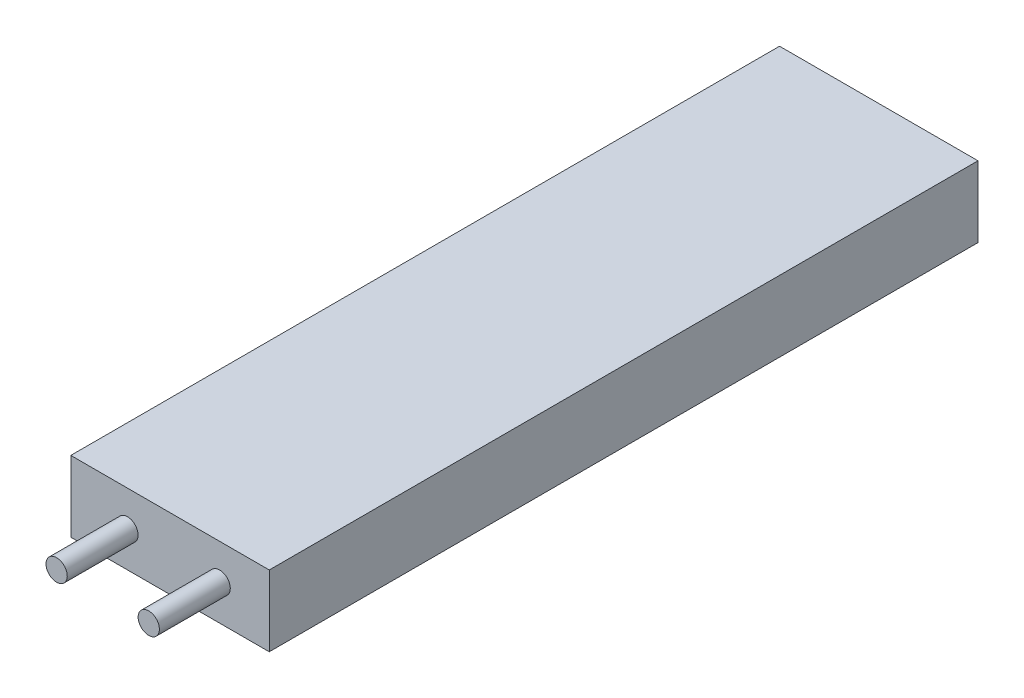
ISO-10303-21;
HEADER;
FILE_DESCRIPTION(('STEP AP214'),'2;1');
FILE_NAME('part.step','',(''),(''),'','','');
FILE_SCHEMA(('AUTOMOTIVE_DESIGN { 1 0 10303 214 1 1 1 1 }'));
ENDSEC;
DATA;
#1=APPLICATION_CONTEXT('core data for automotive mechanical design processes');
#2=APPLICATION_PROTOCOL_DEFINITION('international standard','automotive_design',2000,#1);
#3=PRODUCT_CONTEXT('',#1,'mechanical');
#4=PRODUCT('Part','Part','',(#3));
#5=PRODUCT_RELATED_PRODUCT_CATEGORY('part','',(#4));
#6=PRODUCT_DEFINITION_FORMATION('','',#4);
#7=PRODUCT_DEFINITION_CONTEXT('part definition',#1,'design');
#8=PRODUCT_DEFINITION('design','',#6,#7);
#9=PRODUCT_DEFINITION_SHAPE('','',#8);
#10=(LENGTH_UNIT() NAMED_UNIT(*) SI_UNIT(.MILLI.,.METRE.));
#11=(NAMED_UNIT(*) PLANE_ANGLE_UNIT() SI_UNIT($,.RADIAN.));
#12=(NAMED_UNIT(*) SI_UNIT($,.STERADIAN.) SOLID_ANGLE_UNIT());
#13=UNCERTAINTY_MEASURE_WITH_UNIT(LENGTH_MEASURE(1.E-05),#10,'distance_accuracy_value','');
#14=(GEOMETRIC_REPRESENTATION_CONTEXT(3) GLOBAL_UNCERTAINTY_ASSIGNED_CONTEXT((#13)) GLOBAL_UNIT_ASSIGNED_CONTEXT((#10,
#11,#12)) REPRESENTATION_CONTEXT('',''));
#15=CARTESIAN_POINT('',(0.,0.,0.));
#16=DIRECTION('',(0.,0.,1.));
#17=DIRECTION('',(1.,0.,0.));
#18=AXIS2_PLACEMENT_3D('',#15,#16,#17);
#19=CARTESIAN_POINT('',(-7.,5.,25.));
#20=DIRECTION('',(0.,0.,-1.));
#21=DIRECTION('',(-1.,0.,0.));
#22=AXIS2_PLACEMENT_3D('',#19,#20,#21);
#23=PLANE('',#22);
#24=CARTESIAN_POINT('',(3.5,2.5,25.));
#25=DIRECTION('',(0.,0.,-1.));
#26=DIRECTION('',(-1.,0.,0.));
#27=AXIS2_PLACEMENT_3D('',#24,#25,#26);
#28=CIRCLE('',#27,0.749999999999999);
#29=CARTESIAN_POINT('',(2.75,2.5,25.));
#30=VERTEX_POINT('',#29);
#31=EDGE_CURVE('E11',#30,#30,#28,.F.);
#32=ORIENTED_EDGE('',*,*,#31,.F.);
#33=EDGE_LOOP('',(#32));
#34=FACE_BOUND('',#33,.T.);
#35=CARTESIAN_POINT('',(-3.,2.5,25.));
#36=DIRECTION('',(0.,0.,-1.));
#37=DIRECTION('',(-1.,0.,0.));
#38=AXIS2_PLACEMENT_3D('',#35,#36,#37);
#39=CIRCLE('',#38,0.75);
#40=CARTESIAN_POINT('',(-3.75,2.5,25.));
#41=VERTEX_POINT('',#40);
#42=EDGE_CURVE('E48',#41,#41,#39,.F.);
#43=ORIENTED_EDGE('',*,*,#42,.F.);
#44=EDGE_LOOP('',(#43));
#45=FACE_BOUND('',#44,.T.);
#46=DIRECTION('',(1.,0.,0.));
#47=VECTOR('',#46,1.);
#48=CARTESIAN_POINT('',(-7.,0.,25.));
#49=LINE('',#48,#47);
#50=CARTESIAN_POINT('',(-7.,0.,25.));
#51=VERTEX_POINT('',#50);
#52=CARTESIAN_POINT('',(7.,0.,25.));
#53=VERTEX_POINT('',#52);
#54=EDGE_CURVE('E111',#51,#53,#49,.T.);
#55=ORIENTED_EDGE('',*,*,#54,.T.);
#56=DIRECTION('',(0.,-1.,0.));
#57=VECTOR('',#56,1.);
#58=CARTESIAN_POINT('',(7.,5.,25.));
#59=LINE('',#58,#57);
#60=CARTESIAN_POINT('',(7.,5.,25.));
#61=VERTEX_POINT('',#60);
#62=EDGE_CURVE('E101',#61,#53,#59,.T.);
#63=ORIENTED_EDGE('',*,*,#62,.F.);
#64=DIRECTION('',(1.,0.,0.));
#65=VECTOR('',#64,1.);
#66=CARTESIAN_POINT('',(-7.,5.,25.));
#67=LINE('',#66,#65);
#68=CARTESIAN_POINT('',(-7.,5.,25.));
#69=VERTEX_POINT('',#68);
#70=EDGE_CURVE('E90',#69,#61,#67,.T.);
#71=ORIENTED_EDGE('',*,*,#70,.F.);
#72=DIRECTION('',(0.,-1.,0.));
#73=VECTOR('',#72,1.);
#74=CARTESIAN_POINT('',(-7.,5.,25.));
#75=LINE('',#74,#73);
#76=EDGE_CURVE('E56',#69,#51,#75,.T.);
#77=ORIENTED_EDGE('',*,*,#76,.T.);
#78=EDGE_LOOP('',(#55,#63,#71,#77));
#79=FACE_BOUND('',#78,.T.);
#80=ADVANCED_FACE('F39',(#34,#45,#79),#23,.F.);
#81=CARTESIAN_POINT('',(7.,5.,25.));
#82=DIRECTION('',(-1.,0.,0.));
#83=DIRECTION('',(0.,0.,1.));
#84=AXIS2_PLACEMENT_3D('',#81,#82,#83);
#85=PLANE('',#84);
#86=DIRECTION('',(0.,0.,-1.));
#87=VECTOR('',#86,1.);
#88=CARTESIAN_POINT('',(7.,0.,25.));
#89=LINE('',#88,#87);
#90=CARTESIAN_POINT('',(7.,0.,-25.));
#91=VERTEX_POINT('',#90);
#92=EDGE_CURVE('E97',#53,#91,#89,.T.);
#93=ORIENTED_EDGE('',*,*,#92,.T.);
#94=DIRECTION('',(0.,-1.,0.));
#95=VECTOR('',#94,1.);
#96=CARTESIAN_POINT('',(7.,5.,-25.));
#97=LINE('',#96,#95);
#98=CARTESIAN_POINT('',(7.,5.,-25.));
#99=VERTEX_POINT('',#98);
#100=EDGE_CURVE('E95',#99,#91,#97,.T.);
#101=ORIENTED_EDGE('',*,*,#100,.F.);
#102=DIRECTION('',(0.,0.,-1.));
#103=VECTOR('',#102,1.);
#104=CARTESIAN_POINT('',(7.,5.,25.));
#105=LINE('',#104,#103);
#106=EDGE_CURVE('E82',#61,#99,#105,.T.);
#107=ORIENTED_EDGE('',*,*,#106,.F.);
#108=ORIENTED_EDGE('',*,*,#62,.T.);
#109=EDGE_LOOP('',(#93,#101,#107,#108));
#110=FACE_BOUND('',#109,.T.);
#111=ADVANCED_FACE('F96',(#110),#85,.F.);
#112=CARTESIAN_POINT('',(-7.,5.,-25.));
#113=DIRECTION('',(0.,0.,-1.));
#114=DIRECTION('',(-1.,0.,0.));
#115=AXIS2_PLACEMENT_3D('',#112,#113,#114);
#116=PLANE('',#115);
#117=DIRECTION('',(1.,0.,0.));
#118=VECTOR('',#117,1.);
#119=CARTESIAN_POINT('',(-7.,0.,-25.));
#120=LINE('',#119,#118);
#121=CARTESIAN_POINT('',(-7.,0.,-25.));
#122=VERTEX_POINT('',#121);
#123=EDGE_CURVE('E117',#122,#91,#120,.T.);
#124=ORIENTED_EDGE('',*,*,#123,.F.);
#125=DIRECTION('',(0.,-1.,0.));
#126=VECTOR('',#125,1.);
#127=CARTESIAN_POINT('',(-7.,5.,-25.));
#128=LINE('',#127,#126);
#129=CARTESIAN_POINT('',(-7.,5.,-25.));
#130=VERTEX_POINT('',#129);
#131=EDGE_CURVE('E70',#130,#122,#128,.T.);
#132=ORIENTED_EDGE('',*,*,#131,.F.);
#133=DIRECTION('',(1.,0.,0.));
#134=VECTOR('',#133,1.);
#135=CARTESIAN_POINT('',(-7.,5.,-25.));
#136=LINE('',#135,#134);
#137=EDGE_CURVE('E89',#130,#99,#136,.T.);
#138=ORIENTED_EDGE('',*,*,#137,.T.);
#139=ORIENTED_EDGE('',*,*,#100,.T.);
#140=EDGE_LOOP('',(#124,#132,#138,#139));
#141=FACE_BOUND('',#140,.T.);
#142=ADVANCED_FACE('F103',(#141),#116,.T.);
#143=CARTESIAN_POINT('',(-7.,5.,25.));
#144=DIRECTION('',(-1.,0.,0.));
#145=DIRECTION('',(0.,0.,1.));
#146=AXIS2_PLACEMENT_3D('',#143,#144,#145);
#147=PLANE('',#146);
#148=DIRECTION('',(0.,0.,-1.));
#149=VECTOR('',#148,1.);
#150=CARTESIAN_POINT('',(-7.,0.,25.));
#151=LINE('',#150,#149);
#152=EDGE_CURVE('E120',#51,#122,#151,.T.);
#153=ORIENTED_EDGE('',*,*,#152,.F.);
#154=ORIENTED_EDGE('',*,*,#76,.F.);
#155=DIRECTION('',(0.,0.,-1.));
#156=VECTOR('',#155,1.);
#157=CARTESIAN_POINT('',(-7.,5.,25.));
#158=LINE('',#157,#156);
#159=EDGE_CURVE('E105',#69,#130,#158,.T.);
#160=ORIENTED_EDGE('',*,*,#159,.T.);
#161=ORIENTED_EDGE('',*,*,#131,.T.);
#162=EDGE_LOOP('',(#153,#154,#160,#161));
#163=FACE_BOUND('',#162,.T.);
#164=ADVANCED_FACE('F139',(#163),#147,.T.);
#165=CARTESIAN_POINT('',(0.,5.,0.));
#166=DIRECTION('',(0.,1.,0.));
#167=DIRECTION('',(0.,0.,1.));
#168=AXIS2_PLACEMENT_3D('',#165,#166,#167);
#169=PLANE('',#168);
#170=ORIENTED_EDGE('',*,*,#70,.T.);
#171=ORIENTED_EDGE('',*,*,#106,.T.);
#172=ORIENTED_EDGE('',*,*,#137,.F.);
#173=ORIENTED_EDGE('',*,*,#159,.F.);
#174=EDGE_LOOP('',(#170,#171,#172,#173));
#175=FACE_BOUND('',#174,.T.);
#176=ADVANCED_FACE('F86',(#175),#169,.T.);
#177=CARTESIAN_POINT('',(0.,0.,0.));
#178=DIRECTION('',(0.,1.,0.));
#179=DIRECTION('',(0.,0.,1.));
#180=AXIS2_PLACEMENT_3D('',#177,#178,#179);
#181=PLANE('',#180);
#182=ORIENTED_EDGE('',*,*,#54,.F.);
#183=ORIENTED_EDGE('',*,*,#152,.T.);
#184=ORIENTED_EDGE('',*,*,#123,.T.);
#185=ORIENTED_EDGE('',*,*,#92,.F.);
#186=EDGE_LOOP('',(#182,#183,#184,#185));
#187=FACE_BOUND('',#186,.T.);
#188=ADVANCED_FACE('F138',(#187),#181,.F.);
#189=CARTESIAN_POINT('',(-3.,2.5,30.));
#190=DIRECTION('',(0.,0.,-1.));
#191=DIRECTION('',(-1.,0.,0.));
#192=AXIS2_PLACEMENT_3D('',#189,#190,#191);
#193=CYLINDRICAL_SURFACE('',#192,0.75);
#194=CARTESIAN_POINT('',(-3.,2.5,30.));
#195=DIRECTION('',(0.,0.,1.));
#196=DIRECTION('',(1.,0.,0.));
#197=AXIS2_PLACEMENT_3D('',#194,#195,#196);
#198=CIRCLE('',#197,0.75);
#199=CARTESIAN_POINT('',(-2.25,2.5,30.));
#200=VERTEX_POINT('',#199);
#201=EDGE_CURVE('E114',#200,#200,#198,.T.);
#202=ORIENTED_EDGE('',*,*,#201,.F.);
#203=EDGE_LOOP('',(#202));
#204=FACE_BOUND('',#203,.T.);
#205=ORIENTED_EDGE('',*,*,#42,.T.);
#206=EDGE_LOOP('',(#205));
#207=FACE_BOUND('',#206,.T.);
#208=ADVANCED_FACE('F133',(#204,#207),#193,.T.);
#209=CARTESIAN_POINT('',(-3.,2.5,30.));
#210=DIRECTION('',(0.,0.,1.));
#211=DIRECTION('',(1.,0.,0.));
#212=AXIS2_PLACEMENT_3D('',#209,#210,#211);
#213=PLANE('',#212);
#214=ORIENTED_EDGE('',*,*,#201,.T.);
#215=EDGE_LOOP('',(#214));
#216=FACE_BOUND('',#215,.T.);
#217=ADVANCED_FACE('F188',(#216),#213,.T.);
#218=CARTESIAN_POINT('',(3.5,2.5,30.));
#219=DIRECTION('',(0.,0.,-1.));
#220=DIRECTION('',(-1.,0.,0.));
#221=AXIS2_PLACEMENT_3D('',#218,#219,#220);
#222=CYLINDRICAL_SURFACE('',#221,0.749999999999999);
#223=CARTESIAN_POINT('',(3.5,2.5,30.));
#224=DIRECTION('',(0.,0.,1.));
#225=DIRECTION('',(1.,0.,0.));
#226=AXIS2_PLACEMENT_3D('',#223,#224,#225);
#227=CIRCLE('',#226,0.749999999999999);
#228=CARTESIAN_POINT('',(4.25,2.5,30.));
#229=VERTEX_POINT('',#228);
#230=EDGE_CURVE('E224',#229,#229,#227,.T.);
#231=ORIENTED_EDGE('',*,*,#230,.F.);
#232=EDGE_LOOP('',(#231));
#233=FACE_BOUND('',#232,.T.);
#234=ORIENTED_EDGE('',*,*,#31,.T.);
#235=EDGE_LOOP('',(#234));
#236=FACE_BOUND('',#235,.T.);
#237=ADVANCED_FACE('F198',(#233,#236),#222,.T.);
#238=CARTESIAN_POINT('',(3.5,2.5,30.));
#239=DIRECTION('',(0.,0.,1.));
#240=DIRECTION('',(1.,0.,0.));
#241=AXIS2_PLACEMENT_3D('',#238,#239,#240);
#242=PLANE('',#241);
#243=ORIENTED_EDGE('',*,*,#230,.T.);
#244=EDGE_LOOP('',(#243));
#245=FACE_BOUND('',#244,.T.);
#246=ADVANCED_FACE('F208',(#245),#242,.T.);
#247=CLOSED_SHELL('',(#80,#111,#142,#164,#176,#188,#208,#217,#237,#246));
#248=MANIFOLD_SOLID_BREP('B2',#247);
#249=ADVANCED_BREP_SHAPE_REPRESENTATION('',(#18,#248),#14);
#250=SHAPE_DEFINITION_REPRESENTATION(#9,#249);
ENDSEC;
END-ISO-10303-21;
